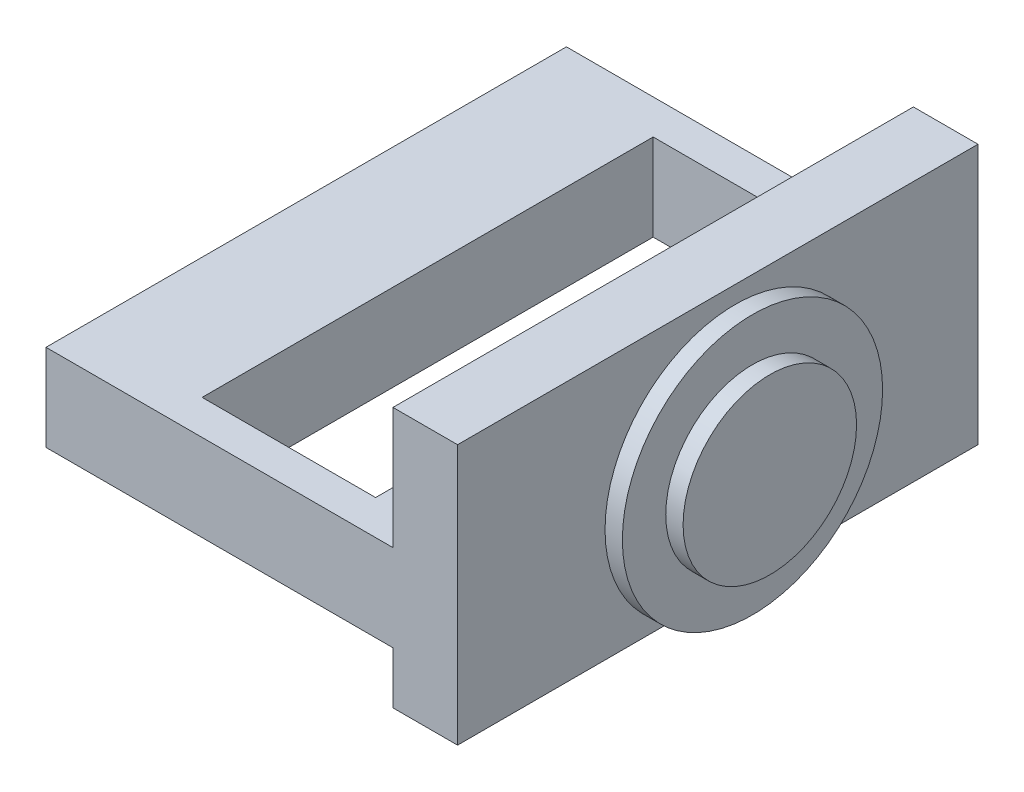
ISO-10303-21;
HEADER;
FILE_DESCRIPTION(('STEP AP214'),'2;1');
FILE_NAME('part.step','',(''),(''),'','','');
FILE_SCHEMA(('AUTOMOTIVE_DESIGN { 1 0 10303 214 1 1 1 1 }'));
ENDSEC;
DATA;
#1=APPLICATION_CONTEXT('core data for automotive mechanical design processes');
#2=APPLICATION_PROTOCOL_DEFINITION('international standard','automotive_design',2000,#1);
#3=PRODUCT_CONTEXT('',#1,'mechanical');
#4=PRODUCT('Part','Part','',(#3));
#5=PRODUCT_RELATED_PRODUCT_CATEGORY('part','',(#4));
#6=PRODUCT_DEFINITION_FORMATION('','',#4);
#7=PRODUCT_DEFINITION_CONTEXT('part definition',#1,'design');
#8=PRODUCT_DEFINITION('design','',#6,#7);
#9=PRODUCT_DEFINITION_SHAPE('','',#8);
#10=(LENGTH_UNIT() NAMED_UNIT(*) SI_UNIT(.MILLI.,.METRE.));
#11=(NAMED_UNIT(*) PLANE_ANGLE_UNIT() SI_UNIT($,.RADIAN.));
#12=(NAMED_UNIT(*) SI_UNIT($,.STERADIAN.) SOLID_ANGLE_UNIT());
#13=UNCERTAINTY_MEASURE_WITH_UNIT(LENGTH_MEASURE(1.E-05),#10,'distance_accuracy_value','');
#14=(GEOMETRIC_REPRESENTATION_CONTEXT(3) GLOBAL_UNCERTAINTY_ASSIGNED_CONTEXT((#13)) GLOBAL_UNIT_ASSIGNED_CONTEXT((#10,
#11,#12)) REPRESENTATION_CONTEXT('',''));
#15=CARTESIAN_POINT('',(0.,0.,0.));
#16=DIRECTION('',(0.,0.,1.));
#17=DIRECTION('',(1.,0.,0.));
#18=AXIS2_PLACEMENT_3D('',#15,#16,#17);
#19=CARTESIAN_POINT('',(5.835185017232,3.15100671140939,30.));
#20=DIRECTION('',(0.,-1.,0.));
#21=DIRECTION('',(1.,0.,0.));
#22=AXIS2_PLACEMENT_3D('',#19,#20,#21);
#23=PLANE('',#22);
#24=DIRECTION('',(0.,0.,1.));
#25=VECTOR('',#24,1.);
#26=CARTESIAN_POINT('',(-7.16481498276801,3.15100671140939,28.));
#27=LINE('',#26,#25);
#28=CARTESIAN_POINT('',(-7.164814982768,3.15100671140939,2.));
#29=VERTEX_POINT('',#28);
#30=CARTESIAN_POINT('',(-7.16481498276801,3.15100671140939,28.));
#31=VERTEX_POINT('',#30);
#32=EDGE_CURVE('E157',#29,#31,#27,.T.);
#33=ORIENTED_EDGE('',*,*,#32,.F.);
#34=DIRECTION('',(-1.,0.,0.));
#35=VECTOR('',#34,1.);
#36=CARTESIAN_POINT('',(-7.164814982768,3.15100671140939,2.));
#37=LINE('',#36,#35);
#38=CARTESIAN_POINT('',(2.83518501723199,3.15100671140939,2.));
#39=VERTEX_POINT('',#38);
#40=EDGE_CURVE('E54',#39,#29,#37,.T.);
#41=ORIENTED_EDGE('',*,*,#40,.F.);
#42=DIRECTION('',(0.,0.,-1.));
#43=VECTOR('',#42,1.);
#44=CARTESIAN_POINT('',(2.83518501723199,3.15100671140939,2.));
#45=LINE('',#44,#43);
#46=CARTESIAN_POINT('',(2.835185017232,3.15100671140939,28.));
#47=VERTEX_POINT('',#46);
#48=EDGE_CURVE('E146',#47,#39,#45,.T.);
#49=ORIENTED_EDGE('',*,*,#48,.F.);
#50=DIRECTION('',(1.,0.,0.));
#51=VECTOR('',#50,1.);
#52=CARTESIAN_POINT('',(2.835185017232,3.15100671140939,28.));
#53=LINE('',#52,#51);
#54=EDGE_CURVE('E149',#31,#47,#53,.T.);
#55=ORIENTED_EDGE('',*,*,#54,.F.);
#56=EDGE_LOOP('',(#33,#41,#49,#55));
#57=FACE_BOUND('',#56,.T.);
#58=DIRECTION('',(-1.,0.,0.));
#59=VECTOR('',#58,1.);
#60=CARTESIAN_POINT('',(5.835185017232,3.15100671140939,0.));
#61=LINE('',#60,#59);
#62=CARTESIAN_POINT('',(5.835185017232,3.15100671140939,0.));
#63=VERTEX_POINT('',#62);
#64=CARTESIAN_POINT('',(-14.164814982768,3.15100671140939,0.));
#65=VERTEX_POINT('',#64);
#66=EDGE_CURVE('E164',#63,#65,#61,.T.);
#67=ORIENTED_EDGE('',*,*,#66,.T.);
#68=DIRECTION('',(0.,0.,-1.));
#69=VECTOR('',#68,1.);
#70=CARTESIAN_POINT('',(-14.164814982768,3.15100671140939,30.));
#71=LINE('',#70,#69);
#72=CARTESIAN_POINT('',(-14.164814982768,3.15100671140939,30.));
#73=VERTEX_POINT('',#72);
#74=EDGE_CURVE('E41',#73,#65,#71,.T.);
#75=ORIENTED_EDGE('',*,*,#74,.F.);
#76=DIRECTION('',(-1.,0.,0.));
#77=VECTOR('',#76,1.);
#78=CARTESIAN_POINT('',(5.835185017232,3.15100671140939,30.));
#79=LINE('',#78,#77);
#80=CARTESIAN_POINT('',(5.835185017232,3.15100671140939,30.));
#81=VERTEX_POINT('',#80);
#82=EDGE_CURVE('E168',#81,#73,#79,.T.);
#83=ORIENTED_EDGE('',*,*,#82,.F.);
#84=DIRECTION('',(0.,0.,-1.));
#85=VECTOR('',#84,1.);
#86=CARTESIAN_POINT('',(5.835185017232,3.15100671140939,30.));
#87=LINE('',#86,#85);
#88=EDGE_CURVE('E186',#81,#63,#87,.T.);
#89=ORIENTED_EDGE('',*,*,#88,.T.);
#90=EDGE_LOOP('',(#67,#75,#83,#89));
#91=FACE_BOUND('',#90,.T.);
#92=ADVANCED_FACE('F38',(#57,#91),#23,.F.);
#93=CARTESIAN_POINT('',(-14.164814982768,3.15100671140939,30.));
#94=DIRECTION('',(1.,0.,0.));
#95=DIRECTION('',(0.,0.,-1.));
#96=AXIS2_PLACEMENT_3D('',#93,#94,#95);
#97=PLANE('',#96);
#98=DIRECTION('',(0.,-1.,0.));
#99=VECTOR('',#98,1.);
#100=CARTESIAN_POINT('',(-14.164814982768,3.15100671140939,0.));
#101=LINE('',#100,#99);
#102=CARTESIAN_POINT('',(-14.164814982768,-1.84899328859061,0.));
#103=VERTEX_POINT('',#102);
#104=EDGE_CURVE('E189',#65,#103,#101,.T.);
#105=ORIENTED_EDGE('',*,*,#104,.T.);
#106=DIRECTION('',(0.,0.,-1.));
#107=VECTOR('',#106,1.);
#108=CARTESIAN_POINT('',(-14.164814982768,-1.84899328859061,30.));
#109=LINE('',#108,#107);
#110=CARTESIAN_POINT('',(-14.164814982768,-1.84899328859061,30.));
#111=VERTEX_POINT('',#110);
#112=EDGE_CURVE('E218',#111,#103,#109,.T.);
#113=ORIENTED_EDGE('',*,*,#112,.F.);
#114=DIRECTION('',(0.,-1.,0.));
#115=VECTOR('',#114,1.);
#116=CARTESIAN_POINT('',(-14.164814982768,3.15100671140939,30.));
#117=LINE('',#116,#115);
#118=EDGE_CURVE('E171',#73,#111,#117,.T.);
#119=ORIENTED_EDGE('',*,*,#118,.F.);
#120=ORIENTED_EDGE('',*,*,#74,.T.);
#121=EDGE_LOOP('',(#105,#113,#119,#120));
#122=FACE_BOUND('',#121,.T.);
#123=ADVANCED_FACE('F267',(#122),#97,.F.);
#124=CARTESIAN_POINT('',(-14.164814982768,-1.84899328859061,30.));
#125=DIRECTION('',(0.,1.,0.));
#126=DIRECTION('',(0.,0.,1.));
#127=AXIS2_PLACEMENT_3D('',#124,#125,#126);
#128=PLANE('',#127);
#129=DIRECTION('',(0.,0.,-1.));
#130=VECTOR('',#129,1.);
#131=CARTESIAN_POINT('',(2.835185017232,-1.84899328859061,2.));
#132=LINE('',#131,#130);
#133=CARTESIAN_POINT('',(2.835185017232,-1.84899328859061,28.));
#134=VERTEX_POINT('',#133);
#135=CARTESIAN_POINT('',(2.835185017232,-1.84899328859061,2.));
#136=VERTEX_POINT('',#135);
#137=EDGE_CURVE('E136',#134,#136,#132,.T.);
#138=ORIENTED_EDGE('',*,*,#137,.T.);
#139=DIRECTION('',(-1.,0.,0.));
#140=VECTOR('',#139,1.);
#141=CARTESIAN_POINT('',(-7.164814982768,-1.84899328859061,2.));
#142=LINE('',#141,#140);
#143=CARTESIAN_POINT('',(-7.164814982768,-1.84899328859061,2.));
#144=VERTEX_POINT('',#143);
#145=EDGE_CURVE('E130',#136,#144,#142,.T.);
#146=ORIENTED_EDGE('',*,*,#145,.T.);
#147=DIRECTION('',(0.,0.,1.));
#148=VECTOR('',#147,1.);
#149=CARTESIAN_POINT('',(-7.164814982768,-1.84899328859061,28.));
#150=LINE('',#149,#148);
#151=CARTESIAN_POINT('',(-7.164814982768,-1.84899328859061,28.));
#152=VERTEX_POINT('',#151);
#153=EDGE_CURVE('E139',#144,#152,#150,.T.);
#154=ORIENTED_EDGE('',*,*,#153,.T.);
#155=DIRECTION('',(1.,0.,0.));
#156=VECTOR('',#155,1.);
#157=CARTESIAN_POINT('',(2.835185017232,-1.84899328859061,28.));
#158=LINE('',#157,#156);
#159=EDGE_CURVE('E62',#152,#134,#158,.T.);
#160=ORIENTED_EDGE('',*,*,#159,.T.);
#161=EDGE_LOOP('',(#138,#146,#154,#160));
#162=FACE_BOUND('',#161,.T.);
#163=DIRECTION('',(1.,0.,0.));
#164=VECTOR('',#163,1.);
#165=CARTESIAN_POINT('',(-14.164814982768,-1.84899328859061,0.));
#166=LINE('',#165,#164);
#167=CARTESIAN_POINT('',(5.835185017232,-1.84899328859061,0.));
#168=VERTEX_POINT('',#167);
#169=EDGE_CURVE('E191',#103,#168,#166,.T.);
#170=ORIENTED_EDGE('',*,*,#169,.T.);
#171=DIRECTION('',(0.,0.,-1.));
#172=VECTOR('',#171,1.);
#173=CARTESIAN_POINT('',(5.835185017232,-1.84899328859061,30.));
#174=LINE('',#173,#172);
#175=CARTESIAN_POINT('',(5.835185017232,-1.84899328859061,30.));
#176=VERTEX_POINT('',#175);
#177=EDGE_CURVE('E216',#176,#168,#174,.T.);
#178=ORIENTED_EDGE('',*,*,#177,.F.);
#179=DIRECTION('',(1.,0.,0.));
#180=VECTOR('',#179,1.);
#181=CARTESIAN_POINT('',(-14.164814982768,-1.84899328859061,30.));
#182=LINE('',#181,#180);
#183=EDGE_CURVE('E174',#111,#176,#182,.T.);
#184=ORIENTED_EDGE('',*,*,#183,.F.);
#185=ORIENTED_EDGE('',*,*,#112,.T.);
#186=EDGE_LOOP('',(#170,#178,#184,#185));
#187=FACE_BOUND('',#186,.T.);
#188=ADVANCED_FACE('F143',(#162,#187),#128,.F.);
#189=CARTESIAN_POINT('',(5.835185017232,-1.84899328859061,30.));
#190=DIRECTION('',(1.,0.,0.));
#191=DIRECTION('',(0.,0.,-1.));
#192=AXIS2_PLACEMENT_3D('',#189,#190,#191);
#193=PLANE('',#192);
#194=DIRECTION('',(0.,-1.,0.));
#195=VECTOR('',#194,1.);
#196=CARTESIAN_POINT('',(5.835185017232,-1.84899328859061,0.));
#197=LINE('',#196,#195);
#198=CARTESIAN_POINT('',(5.835185017232,-4.84899328859061,0.));
#199=VERTEX_POINT('',#198);
#200=EDGE_CURVE('E193',#168,#199,#197,.T.);
#201=ORIENTED_EDGE('',*,*,#200,.T.);
#202=DIRECTION('',(0.,0.,-1.));
#203=VECTOR('',#202,1.);
#204=CARTESIAN_POINT('',(5.835185017232,-4.84899328859061,30.));
#205=LINE('',#204,#203);
#206=CARTESIAN_POINT('',(5.835185017232,-4.84899328859061,30.));
#207=VERTEX_POINT('',#206);
#208=EDGE_CURVE('E213',#207,#199,#205,.T.);
#209=ORIENTED_EDGE('',*,*,#208,.F.);
#210=DIRECTION('',(0.,-1.,0.));
#211=VECTOR('',#210,1.);
#212=CARTESIAN_POINT('',(5.835185017232,-1.84899328859061,30.));
#213=LINE('',#212,#211);
#214=EDGE_CURVE('E176',#176,#207,#213,.T.);
#215=ORIENTED_EDGE('',*,*,#214,.F.);
#216=ORIENTED_EDGE('',*,*,#177,.T.);
#217=EDGE_LOOP('',(#201,#209,#215,#216));
#218=FACE_BOUND('',#217,.T.);
#219=ADVANCED_FACE('F264',(#218),#193,.F.);
#220=CARTESIAN_POINT('',(5.835185017232,-4.84899328859061,30.));
#221=DIRECTION('',(0.,1.,0.));
#222=DIRECTION('',(0.,0.,1.));
#223=AXIS2_PLACEMENT_3D('',#220,#221,#222);
#224=PLANE('',#223);
#225=DIRECTION('',(1.,0.,0.));
#226=VECTOR('',#225,1.);
#227=CARTESIAN_POINT('',(5.835185017232,-4.84899328859061,0.));
#228=LINE('',#227,#226);
#229=CARTESIAN_POINT('',(9.5600172319971,-4.84899328859061,0.));
#230=VERTEX_POINT('',#229);
#231=EDGE_CURVE('E195',#199,#230,#228,.T.);
#232=ORIENTED_EDGE('',*,*,#231,.T.);
#233=DIRECTION('',(0.,0.,-1.));
#234=VECTOR('',#233,1.);
#235=CARTESIAN_POINT('',(9.5600172319971,-4.84899328859061,30.));
#236=LINE('',#235,#234);
#237=CARTESIAN_POINT('',(9.5600172319971,-4.84899328859061,30.));
#238=VERTEX_POINT('',#237);
#239=EDGE_CURVE('E210',#238,#230,#236,.T.);
#240=ORIENTED_EDGE('',*,*,#239,.F.);
#241=DIRECTION('',(1.,0.,0.));
#242=VECTOR('',#241,1.);
#243=CARTESIAN_POINT('',(5.835185017232,-4.84899328859061,30.));
#244=LINE('',#243,#242);
#245=EDGE_CURVE('E178',#207,#238,#244,.T.);
#246=ORIENTED_EDGE('',*,*,#245,.F.);
#247=ORIENTED_EDGE('',*,*,#208,.T.);
#248=EDGE_LOOP('',(#232,#240,#246,#247));
#249=FACE_BOUND('',#248,.T.);
#250=ADVANCED_FACE('F235',(#249),#224,.F.);
#251=CARTESIAN_POINT('',(9.5600172319971,-4.84899328859061,30.));
#252=DIRECTION('',(-1.,0.,0.));
#253=DIRECTION('',(0.,0.,1.));
#254=AXIS2_PLACEMENT_3D('',#251,#252,#253);
#255=PLANE('',#254);
#256=CARTESIAN_POINT('',(9.5600172319971,2.65100671140939,15.));
#257=DIRECTION('',(1.,0.,0.));
#258=DIRECTION('',(0.,0.,-1.));
#259=AXIS2_PLACEMENT_3D('',#256,#257,#258);
#260=CIRCLE('',#259,5.);
#261=CARTESIAN_POINT('',(9.5600172319971,2.65100671140939,10.));
#262=VERTEX_POINT('',#261);
#263=EDGE_CURVE('E46',#262,#262,#260,.T.);
#264=ORIENTED_EDGE('',*,*,#263,.F.);
#265=EDGE_LOOP('',(#264));
#266=FACE_BOUND('',#265,.T.);
#267=DIRECTION('',(0.,1.,0.));
#268=VECTOR('',#267,1.);
#269=CARTESIAN_POINT('',(9.5600172319971,-4.84899328859061,0.));
#270=LINE('',#269,#268);
#271=CARTESIAN_POINT('',(9.5600172319971,10.1510067114094,0.));
#272=VERTEX_POINT('',#271);
#273=EDGE_CURVE('E197',#230,#272,#270,.T.);
#274=ORIENTED_EDGE('',*,*,#273,.T.);
#275=DIRECTION('',(0.,0.,-1.));
#276=VECTOR('',#275,1.);
#277=CARTESIAN_POINT('',(9.5600172319971,10.1510067114094,30.));
#278=LINE('',#277,#276);
#279=CARTESIAN_POINT('',(9.5600172319971,10.1510067114094,30.));
#280=VERTEX_POINT('',#279);
#281=EDGE_CURVE('E207',#280,#272,#278,.T.);
#282=ORIENTED_EDGE('',*,*,#281,.F.);
#283=DIRECTION('',(0.,1.,0.));
#284=VECTOR('',#283,1.);
#285=CARTESIAN_POINT('',(9.5600172319971,-4.84899328859061,30.));
#286=LINE('',#285,#284);
#287=EDGE_CURVE('E180',#238,#280,#286,.T.);
#288=ORIENTED_EDGE('',*,*,#287,.F.);
#289=ORIENTED_EDGE('',*,*,#239,.T.);
#290=EDGE_LOOP('',(#274,#282,#288,#289));
#291=FACE_BOUND('',#290,.T.);
#292=ADVANCED_FACE('F231',(#266,#291),#255,.F.);
#293=CARTESIAN_POINT('',(9.5600172319971,10.1510067114094,30.));
#294=DIRECTION('',(0.,-1.,0.));
#295=DIRECTION('',(0.,0.,-1.));
#296=AXIS2_PLACEMENT_3D('',#293,#294,#295);
#297=PLANE('',#296);
#298=DIRECTION('',(-1.,0.,0.));
#299=VECTOR('',#298,1.);
#300=CARTESIAN_POINT('',(9.5600172319971,10.1510067114094,0.));
#301=LINE('',#300,#299);
#302=CARTESIAN_POINT('',(5.835185017232,10.1510067114094,0.));
#303=VERTEX_POINT('',#302);
#304=EDGE_CURVE('E199',#272,#303,#301,.T.);
#305=ORIENTED_EDGE('',*,*,#304,.T.);
#306=DIRECTION('',(0.,0.,-1.));
#307=VECTOR('',#306,1.);
#308=CARTESIAN_POINT('',(5.835185017232,10.1510067114094,30.));
#309=LINE('',#308,#307);
#310=CARTESIAN_POINT('',(5.835185017232,10.1510067114094,30.));
#311=VERTEX_POINT('',#310);
#312=EDGE_CURVE('E204',#311,#303,#309,.T.);
#313=ORIENTED_EDGE('',*,*,#312,.F.);
#314=DIRECTION('',(-1.,0.,0.));
#315=VECTOR('',#314,1.);
#316=CARTESIAN_POINT('',(9.5600172319971,10.1510067114094,30.));
#317=LINE('',#316,#315);
#318=EDGE_CURVE('E182',#280,#311,#317,.T.);
#319=ORIENTED_EDGE('',*,*,#318,.F.);
#320=ORIENTED_EDGE('',*,*,#281,.T.);
#321=EDGE_LOOP('',(#305,#313,#319,#320));
#322=FACE_BOUND('',#321,.T.);
#323=ADVANCED_FACE('F234',(#322),#297,.F.);
#324=CARTESIAN_POINT('',(5.835185017232,10.1510067114094,30.));
#325=DIRECTION('',(1.,0.,0.));
#326=DIRECTION('',(0.,1.,0.));
#327=AXIS2_PLACEMENT_3D('',#324,#325,#326);
#328=PLANE('',#327);
#329=DIRECTION('',(0.,-1.,0.));
#330=VECTOR('',#329,1.);
#331=CARTESIAN_POINT('',(5.835185017232,10.1510067114094,0.));
#332=LINE('',#331,#330);
#333=EDGE_CURVE('E172',#303,#63,#332,.T.);
#334=ORIENTED_EDGE('',*,*,#333,.T.);
#335=ORIENTED_EDGE('',*,*,#88,.F.);
#336=DIRECTION('',(0.,-1.,0.));
#337=VECTOR('',#336,1.);
#338=CARTESIAN_POINT('',(5.835185017232,10.1510067114094,30.));
#339=LINE('',#338,#337);
#340=EDGE_CURVE('E184',#311,#81,#339,.T.);
#341=ORIENTED_EDGE('',*,*,#340,.F.);
#342=ORIENTED_EDGE('',*,*,#312,.T.);
#343=EDGE_LOOP('',(#334,#335,#341,#342));
#344=FACE_BOUND('',#343,.T.);
#345=ADVANCED_FACE('F252',(#344),#328,.F.);
#346=CARTESIAN_POINT('',(0.,0.,30.));
#347=DIRECTION('',(0.,0.,1.));
#348=DIRECTION('',(1.,0.,0.));
#349=AXIS2_PLACEMENT_3D('',#346,#347,#348);
#350=PLANE('',#349);
#351=ORIENTED_EDGE('',*,*,#82,.T.);
#352=ORIENTED_EDGE('',*,*,#118,.T.);
#353=ORIENTED_EDGE('',*,*,#183,.T.);
#354=ORIENTED_EDGE('',*,*,#214,.T.);
#355=ORIENTED_EDGE('',*,*,#245,.T.);
#356=ORIENTED_EDGE('',*,*,#287,.T.);
#357=ORIENTED_EDGE('',*,*,#318,.T.);
#358=ORIENTED_EDGE('',*,*,#340,.T.);
#359=EDGE_LOOP('',(#351,#352,#353,#354,#355,#356,#357,#358));
#360=FACE_BOUND('',#359,.T.);
#361=ADVANCED_FACE('F257',(#360),#350,.T.);
#362=CARTESIAN_POINT('',(0.,0.,0.));
#363=DIRECTION('',(0.,0.,1.));
#364=DIRECTION('',(1.,0.,0.));
#365=AXIS2_PLACEMENT_3D('',#362,#363,#364);
#366=PLANE('',#365);
#367=ORIENTED_EDGE('',*,*,#66,.F.);
#368=ORIENTED_EDGE('',*,*,#333,.F.);
#369=ORIENTED_EDGE('',*,*,#304,.F.);
#370=ORIENTED_EDGE('',*,*,#273,.F.);
#371=ORIENTED_EDGE('',*,*,#231,.F.);
#372=ORIENTED_EDGE('',*,*,#200,.F.);
#373=ORIENTED_EDGE('',*,*,#169,.F.);
#374=ORIENTED_EDGE('',*,*,#104,.F.);
#375=EDGE_LOOP('',(#367,#368,#369,#370,#371,#372,#373,#374));
#376=FACE_BOUND('',#375,.T.);
#377=ADVANCED_FACE('F249',(#376),#366,.F.);
#378=CARTESIAN_POINT('',(-7.164814982768,-1.84899328859061,2.));
#379=DIRECTION('',(0.,0.,-1.));
#380=DIRECTION('',(-1.,0.,0.));
#381=AXIS2_PLACEMENT_3D('',#378,#379,#380);
#382=PLANE('',#381);
#383=ORIENTED_EDGE('',*,*,#40,.T.);
#384=DIRECTION('',(0.,1.,0.));
#385=VECTOR('',#384,1.);
#386=CARTESIAN_POINT('',(-7.164814982768,-1.84899328859061,2.));
#387=LINE('',#386,#385);
#388=EDGE_CURVE('E126',#144,#29,#387,.T.);
#389=ORIENTED_EDGE('',*,*,#388,.F.);
#390=ORIENTED_EDGE('',*,*,#145,.F.);
#391=DIRECTION('',(0.,1.,0.));
#392=VECTOR('',#391,1.);
#393=CARTESIAN_POINT('',(2.835185017232,-1.84899328859061,2.));
#394=LINE('',#393,#392);
#395=EDGE_CURVE('E162',#136,#39,#394,.T.);
#396=ORIENTED_EDGE('',*,*,#395,.T.);
#397=EDGE_LOOP('',(#383,#389,#390,#396));
#398=FACE_BOUND('',#397,.T.);
#399=ADVANCED_FACE('F128',(#398),#382,.F.);
#400=CARTESIAN_POINT('',(2.835185017232,-1.84899328859061,2.));
#401=DIRECTION('',(1.,0.,0.));
#402=DIRECTION('',(0.,1.,0.));
#403=AXIS2_PLACEMENT_3D('',#400,#401,#402);
#404=PLANE('',#403);
#405=ORIENTED_EDGE('',*,*,#48,.T.);
#406=ORIENTED_EDGE('',*,*,#395,.F.);
#407=ORIENTED_EDGE('',*,*,#137,.F.);
#408=DIRECTION('',(0.,1.,0.));
#409=VECTOR('',#408,1.);
#410=CARTESIAN_POINT('',(2.835185017232,-1.84899328859061,28.));
#411=LINE('',#410,#409);
#412=EDGE_CURVE('E165',#134,#47,#411,.T.);
#413=ORIENTED_EDGE('',*,*,#412,.T.);
#414=EDGE_LOOP('',(#405,#406,#407,#413));
#415=FACE_BOUND('',#414,.T.);
#416=ADVANCED_FACE('F282',(#415),#404,.F.);
#417=CARTESIAN_POINT('',(2.835185017232,-1.84899328859061,28.));
#418=DIRECTION('',(0.,0.,1.));
#419=DIRECTION('',(1.,0.,0.));
#420=AXIS2_PLACEMENT_3D('',#417,#418,#419);
#421=PLANE('',#420);
#422=ORIENTED_EDGE('',*,*,#54,.T.);
#423=ORIENTED_EDGE('',*,*,#412,.F.);
#424=ORIENTED_EDGE('',*,*,#159,.F.);
#425=DIRECTION('',(0.,1.,0.));
#426=VECTOR('',#425,1.);
#427=CARTESIAN_POINT('',(-7.164814982768,-1.84899328859061,28.));
#428=LINE('',#427,#426);
#429=EDGE_CURVE('E135',#152,#31,#428,.T.);
#430=ORIENTED_EDGE('',*,*,#429,.T.);
#431=EDGE_LOOP('',(#422,#423,#424,#430));
#432=FACE_BOUND('',#431,.T.);
#433=ADVANCED_FACE('F280',(#432),#421,.F.);
#434=CARTESIAN_POINT('',(-7.164814982768,-1.84899328859061,28.));
#435=DIRECTION('',(-1.,0.,0.));
#436=DIRECTION('',(0.,-1.,0.));
#437=AXIS2_PLACEMENT_3D('',#434,#435,#436);
#438=PLANE('',#437);
#439=ORIENTED_EDGE('',*,*,#32,.T.);
#440=ORIENTED_EDGE('',*,*,#429,.F.);
#441=ORIENTED_EDGE('',*,*,#153,.F.);
#442=ORIENTED_EDGE('',*,*,#388,.T.);
#443=EDGE_LOOP('',(#439,#440,#441,#442));
#444=FACE_BOUND('',#443,.T.);
#445=ADVANCED_FACE('F140',(#444),#438,.F.);
#446=CARTESIAN_POINT('',(10.5600172319971,2.65100671140939,15.));
#447=DIRECTION('',(-1.,0.,0.));
#448=DIRECTION('',(0.,0.,1.));
#449=AXIS2_PLACEMENT_3D('',#446,#447,#448);
#450=CYLINDRICAL_SURFACE('',#449,5.);
#451=CARTESIAN_POINT('',(10.5600172319971,2.65100671140939,15.));
#452=DIRECTION('',(1.,0.,0.));
#453=DIRECTION('',(0.,0.,-1.));
#454=AXIS2_PLACEMENT_3D('',#451,#452,#453);
#455=CIRCLE('',#454,5.);
#456=CARTESIAN_POINT('',(10.5600172319971,2.65100671140939,10.));
#457=VERTEX_POINT('',#456);
#458=EDGE_CURVE('E158',#457,#457,#455,.T.);
#459=ORIENTED_EDGE('',*,*,#458,.F.);
#460=EDGE_LOOP('',(#459));
#461=FACE_BOUND('',#460,.T.);
#462=ORIENTED_EDGE('',*,*,#263,.T.);
#463=EDGE_LOOP('',(#462));
#464=FACE_BOUND('',#463,.T.);
#465=ADVANCED_FACE('F229',(#461,#464),#450,.T.);
#466=CARTESIAN_POINT('',(11.5600172319971,2.65100671140939,15.));
#467=DIRECTION('',(-1.,0.,0.));
#468=DIRECTION('',(0.,0.,1.));
#469=AXIS2_PLACEMENT_3D('',#466,#467,#468);
#470=CYLINDRICAL_SURFACE('',#469,7.5);
#471=CARTESIAN_POINT('',(11.5600172319971,2.65100671140939,15.));
#472=DIRECTION('',(1.,0.,0.));
#473=DIRECTION('',(0.,0.,-1.));
#474=AXIS2_PLACEMENT_3D('',#471,#472,#473);
#475=CIRCLE('',#474,7.5);
#476=CARTESIAN_POINT('',(11.5600172319971,2.65100671140939,7.5));
#477=VERTEX_POINT('',#476);
#478=EDGE_CURVE('E418',#477,#477,#475,.T.);
#479=ORIENTED_EDGE('',*,*,#478,.F.);
#480=EDGE_LOOP('',(#479));
#481=FACE_BOUND('',#480,.T.);
#482=CARTESIAN_POINT('',(10.5600172319971,2.65100671140939,15.));
#483=DIRECTION('',(1.,0.,0.));
#484=DIRECTION('',(0.,0.,-1.));
#485=AXIS2_PLACEMENT_3D('',#482,#483,#484);
#486=CIRCLE('',#485,7.5);
#487=CARTESIAN_POINT('',(10.5600172319971,2.65100671140939,7.5));
#488=VERTEX_POINT('',#487);
#489=EDGE_CURVE('E415',#488,#488,#486,.T.);
#490=ORIENTED_EDGE('',*,*,#489,.T.);
#491=EDGE_LOOP('',(#490));
#492=FACE_BOUND('',#491,.T.);
#493=ADVANCED_FACE('F360',(#481,#492),#470,.T.);
#494=CARTESIAN_POINT('',(11.5600172319971,2.65100671140939,15.));
#495=DIRECTION('',(1.,0.,0.));
#496=DIRECTION('',(0.,0.,-1.));
#497=AXIS2_PLACEMENT_3D('',#494,#495,#496);
#498=PLANE('',#497);
#499=CARTESIAN_POINT('',(11.5600172319971,2.65100671140939,15.));
#500=DIRECTION('',(1.,0.,0.));
#501=DIRECTION('',(0.,0.,-1.));
#502=AXIS2_PLACEMENT_3D('',#499,#500,#501);
#503=CIRCLE('',#502,5.);
#504=CARTESIAN_POINT('',(11.5600172319971,2.65100671140939,10.));
#505=VERTEX_POINT('',#504);
#506=EDGE_CURVE('E11',#505,#505,#503,.T.);
#507=ORIENTED_EDGE('',*,*,#506,.F.);
#508=EDGE_LOOP('',(#507));
#509=FACE_BOUND('',#508,.T.);
#510=ORIENTED_EDGE('',*,*,#478,.T.);
#511=EDGE_LOOP('',(#510));
#512=FACE_BOUND('',#511,.T.);
#513=ADVANCED_FACE('F366',(#509,#512),#498,.T.);
#514=CARTESIAN_POINT('',(10.5600172319971,2.65100671140939,15.));
#515=DIRECTION('',(1.,0.,0.));
#516=DIRECTION('',(0.,0.,-1.));
#517=AXIS2_PLACEMENT_3D('',#514,#515,#516);
#518=PLANE('',#517);
#519=ORIENTED_EDGE('',*,*,#458,.T.);
#520=EDGE_LOOP('',(#519));
#521=FACE_BOUND('',#520,.T.);
#522=ORIENTED_EDGE('',*,*,#489,.F.);
#523=EDGE_LOOP('',(#522));
#524=FACE_BOUND('',#523,.T.);
#525=ADVANCED_FACE('F374',(#521,#524),#518,.F.);
#526=CARTESIAN_POINT('',(12.5600172319971,2.65100671140939,15.));
#527=DIRECTION('',(-1.,0.,0.));
#528=DIRECTION('',(0.,0.,1.));
#529=AXIS2_PLACEMENT_3D('',#526,#527,#528);
#530=CYLINDRICAL_SURFACE('',#529,5.);
#531=CARTESIAN_POINT('',(12.5600172319971,2.65100671140939,15.));
#532=DIRECTION('',(1.,0.,0.));
#533=DIRECTION('',(0.,0.,-1.));
#534=AXIS2_PLACEMENT_3D('',#531,#532,#533);
#535=CIRCLE('',#534,5.);
#536=CARTESIAN_POINT('',(12.5600172319971,2.65100671140939,10.));
#537=VERTEX_POINT('',#536);
#538=EDGE_CURVE('E414',#537,#537,#535,.T.);
#539=ORIENTED_EDGE('',*,*,#538,.F.);
#540=EDGE_LOOP('',(#539));
#541=FACE_BOUND('',#540,.T.);
#542=ORIENTED_EDGE('',*,*,#506,.T.);
#543=EDGE_LOOP('',(#542));
#544=FACE_BOUND('',#543,.T.);
#545=ADVANCED_FACE('F382',(#541,#544),#530,.T.);
#546=CARTESIAN_POINT('',(12.5600172319971,2.65100671140939,15.));
#547=DIRECTION('',(1.,0.,0.));
#548=DIRECTION('',(0.,0.,-1.));
#549=AXIS2_PLACEMENT_3D('',#546,#547,#548);
#550=PLANE('',#549);
#551=ORIENTED_EDGE('',*,*,#538,.T.);
#552=EDGE_LOOP('',(#551));
#553=FACE_BOUND('',#552,.T.);
#554=ADVANCED_FACE('F389',(#553),#550,.T.);
#555=CLOSED_SHELL('',(#92,#123,#188,#219,#250,#292,#323,#345,#361,#377,#399,#416,#433,#445,#465,
#493,#513,#525,#545,#554));
#556=MANIFOLD_SOLID_BREP('B2',#555);
#557=ADVANCED_BREP_SHAPE_REPRESENTATION('',(#18,#556),#14);
#558=SHAPE_DEFINITION_REPRESENTATION(#9,#557);
ENDSEC;
END-ISO-10303-21;
